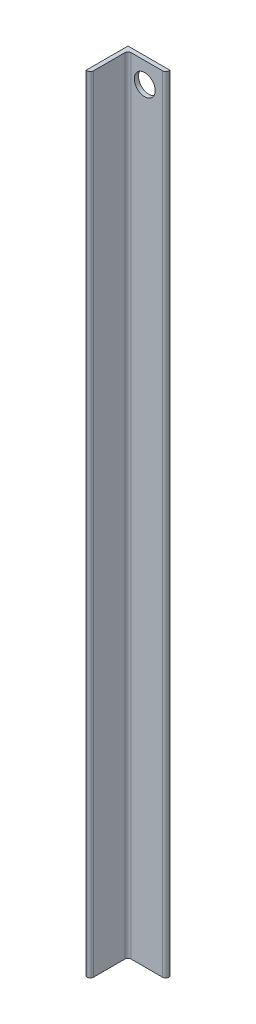
ISO-10303-21;
HEADER;
FILE_DESCRIPTION(('STEP AP214'),'2;1');
FILE_NAME('part.step','',(''),(''),'','','');
FILE_SCHEMA(('AUTOMOTIVE_DESIGN { 1 0 10303 214 1 1 1 1 }'));
ENDSEC;
DATA;
#1=APPLICATION_CONTEXT('core data for automotive mechanical design processes');
#2=APPLICATION_PROTOCOL_DEFINITION('international standard','automotive_design',2000,#1);
#3=PRODUCT_CONTEXT('',#1,'mechanical');
#4=PRODUCT('Part','Part','',(#3));
#5=PRODUCT_RELATED_PRODUCT_CATEGORY('part','',(#4));
#6=PRODUCT_DEFINITION_FORMATION('','',#4);
#7=PRODUCT_DEFINITION_CONTEXT('part definition',#1,'design');
#8=PRODUCT_DEFINITION('design','',#6,#7);
#9=PRODUCT_DEFINITION_SHAPE('','',#8);
#10=(LENGTH_UNIT() NAMED_UNIT(*) SI_UNIT(.MILLI.,.METRE.));
#11=(NAMED_UNIT(*) PLANE_ANGLE_UNIT() SI_UNIT($,.RADIAN.));
#12=(NAMED_UNIT(*) SI_UNIT($,.STERADIAN.) SOLID_ANGLE_UNIT());
#13=UNCERTAINTY_MEASURE_WITH_UNIT(LENGTH_MEASURE(1.E-05),#10,'distance_accuracy_value','');
#14=(GEOMETRIC_REPRESENTATION_CONTEXT(3) GLOBAL_UNCERTAINTY_ASSIGNED_CONTEXT((#13)) GLOBAL_UNIT_ASSIGNED_CONTEXT((#10,
#11,#12)) REPRESENTATION_CONTEXT('',''));
#15=CARTESIAN_POINT('',(0.,0.,0.));
#16=DIRECTION('',(0.,0.,1.));
#17=DIRECTION('',(1.,0.,0.));
#18=AXIS2_PLACEMENT_3D('',#15,#16,#17);
#19=CARTESIAN_POINT('',(-27.4998721449561,750.,-28.2131532770167));
#20=DIRECTION('',(-1.,0.,0.));
#21=DIRECTION('',(0.,0.,1.));
#22=AXIS2_PLACEMENT_3D('',#19,#20,#21);
#23=PLANE('',#22);
#24=DIRECTION('',(0.,0.,-1.));
#25=VECTOR('',#24,1.);
#26=CARTESIAN_POINT('',(-27.4998721449561,0.,-28.2131532770167));
#27=LINE('',#26,#25);
#28=CARTESIAN_POINT('',(-27.4998721449561,0.,-28.2131532770167));
#29=VERTEX_POINT('',#28);
#30=CARTESIAN_POINT('',(-27.4998721449561,0.,-29.2131532770167));
#31=VERTEX_POINT('',#30);
#32=EDGE_CURVE('E153',#29,#31,#27,.T.);
#33=ORIENTED_EDGE('',*,*,#32,.T.);
#34=DIRECTION('',(0.,-1.,0.));
#35=VECTOR('',#34,1.);
#36=CARTESIAN_POINT('',(-27.4998721449561,750.,-29.2131532770167));
#37=LINE('',#36,#35);
#38=CARTESIAN_POINT('',(-27.4998721449561,750.,-29.2131532770167));
#39=VERTEX_POINT('',#38);
#40=EDGE_CURVE('E13',#39,#31,#37,.T.);
#41=ORIENTED_EDGE('',*,*,#40,.F.);
#42=DIRECTION('',(0.,0.,-1.));
#43=VECTOR('',#42,1.);
#44=CARTESIAN_POINT('',(-27.4998721449561,750.,-28.2131532770167));
#45=LINE('',#44,#43);
#46=CARTESIAN_POINT('',(-27.4998721449561,750.,-28.2131532770167));
#47=VERTEX_POINT('',#46);
#48=EDGE_CURVE('E170',#47,#39,#45,.T.);
#49=ORIENTED_EDGE('',*,*,#48,.F.);
#50=DIRECTION('',(0.,-1.,0.));
#51=VECTOR('',#50,1.);
#52=CARTESIAN_POINT('',(-27.4998721449561,750.,-28.2131532770167));
#53=LINE('',#52,#51);
#54=EDGE_CURVE('E149',#47,#29,#53,.T.);
#55=ORIENTED_EDGE('',*,*,#54,.T.);
#56=EDGE_LOOP('',(#33,#41,#49,#55));
#57=FACE_BOUND('',#56,.T.);
#58=ADVANCED_FACE('F51',(#57),#23,.F.);
#59=CARTESIAN_POINT('',(-27.4998721449561,750.,-29.2131532770167));
#60=DIRECTION('',(0.,0.,1.));
#61=DIRECTION('',(1.,0.,0.));
#62=AXIS2_PLACEMENT_3D('',#59,#60,#61);
#63=PLANE('',#62);
#64=CARTESIAN_POINT('',(-47.4998721449523,730.,-29.2131532770167));
#65=DIRECTION('',(0.,0.,1.));
#66=DIRECTION('',(1.,0.,0.));
#67=AXIS2_PLACEMENT_3D('',#64,#65,#66);
#68=CIRCLE('',#67,10.);
#69=CARTESIAN_POINT('',(-37.4998721449523,730.,-29.2131532770167));
#70=VERTEX_POINT('',#69);
#71=EDGE_CURVE('E157',#70,#70,#68,.T.);
#72=ORIENTED_EDGE('',*,*,#71,.T.);
#73=EDGE_LOOP('',(#72));
#74=FACE_BOUND('',#73,.T.);
#75=DIRECTION('',(-1.,0.,0.));
#76=VECTOR('',#75,1.);
#77=CARTESIAN_POINT('',(-27.4998721449561,0.,-29.2131532770167));
#78=LINE('',#77,#76);
#79=CARTESIAN_POINT('',(-67.4998721449561,0.,-29.2131532770167));
#80=VERTEX_POINT('',#79);
#81=EDGE_CURVE('E156',#31,#80,#78,.T.);
#82=ORIENTED_EDGE('',*,*,#81,.T.);
#83=DIRECTION('',(0.,-1.,0.));
#84=VECTOR('',#83,1.);
#85=CARTESIAN_POINT('',(-67.4998721449561,750.,-29.2131532770167));
#86=LINE('',#85,#84);
#87=CARTESIAN_POINT('',(-67.4998721449561,750.,-29.2131532770167));
#88=VERTEX_POINT('',#87);
#89=EDGE_CURVE('E59',#88,#80,#86,.T.);
#90=ORIENTED_EDGE('',*,*,#89,.F.);
#91=DIRECTION('',(-1.,0.,0.));
#92=VECTOR('',#91,1.);
#93=CARTESIAN_POINT('',(-27.4998721449561,750.,-29.2131532770167));
#94=LINE('',#93,#92);
#95=EDGE_CURVE('E113',#39,#88,#94,.T.);
#96=ORIENTED_EDGE('',*,*,#95,.F.);
#97=ORIENTED_EDGE('',*,*,#40,.T.);
#98=EDGE_LOOP('',(#82,#90,#96,#97));
#99=FACE_BOUND('',#98,.T.);
#100=ADVANCED_FACE('F217',(#74,#99),#63,.F.);
#101=CARTESIAN_POINT('',(-67.4998721449561,750.,-29.2131532770167));
#102=DIRECTION('',(1.,0.,0.));
#103=DIRECTION('',(0.,0.,-1.));
#104=AXIS2_PLACEMENT_3D('',#101,#102,#103);
#105=PLANE('',#104);
#106=DIRECTION('',(0.,0.,1.));
#107=VECTOR('',#106,1.);
#108=CARTESIAN_POINT('',(-67.4998721449561,0.,-29.2131532770167));
#109=LINE('',#108,#107);
#110=CARTESIAN_POINT('',(-67.4998721449561,0.,10.7868467229834));
#111=VERTEX_POINT('',#110);
#112=EDGE_CURVE('E159',#80,#111,#109,.T.);
#113=ORIENTED_EDGE('',*,*,#112,.T.);
#114=DIRECTION('',(0.,-1.,0.));
#115=VECTOR('',#114,1.);
#116=CARTESIAN_POINT('',(-67.4998721449561,750.,10.7868467229834));
#117=LINE('',#116,#115);
#118=CARTESIAN_POINT('',(-67.4998721449561,750.,10.7868467229834));
#119=VERTEX_POINT('',#118);
#120=EDGE_CURVE('E180',#119,#111,#117,.T.);
#121=ORIENTED_EDGE('',*,*,#120,.F.);
#122=DIRECTION('',(0.,0.,1.));
#123=VECTOR('',#122,1.);
#124=CARTESIAN_POINT('',(-67.4998721449561,750.,-29.2131532770167));
#125=LINE('',#124,#123);
#126=EDGE_CURVE('E188',#88,#119,#125,.T.);
#127=ORIENTED_EDGE('',*,*,#126,.F.);
#128=ORIENTED_EDGE('',*,*,#89,.T.);
#129=EDGE_LOOP('',(#113,#121,#127,#128));
#130=FACE_BOUND('',#129,.T.);
#131=ADVANCED_FACE('F186',(#130),#105,.F.);
#132=CARTESIAN_POINT('',(-67.4998721449561,750.,10.7868467229834));
#133=DIRECTION('',(0.,0.,-1.));
#134=DIRECTION('',(-1.,0.,0.));
#135=AXIS2_PLACEMENT_3D('',#132,#133,#134);
#136=PLANE('',#135);
#137=DIRECTION('',(1.,0.,0.));
#138=VECTOR('',#137,1.);
#139=CARTESIAN_POINT('',(-67.4998721449561,0.,10.7868467229834));
#140=LINE('',#139,#138);
#141=CARTESIAN_POINT('',(-66.4998721449561,0.,10.7868467229834));
#142=VERTEX_POINT('',#141);
#143=EDGE_CURVE('E161',#111,#142,#140,.T.);
#144=ORIENTED_EDGE('',*,*,#143,.T.);
#145=DIRECTION('',(0.,-1.,0.));
#146=VECTOR('',#145,1.);
#147=CARTESIAN_POINT('',(-66.4998721449561,750.,10.7868467229834));
#148=LINE('',#147,#146);
#149=CARTESIAN_POINT('',(-66.4998721449561,750.,10.7868467229834));
#150=VERTEX_POINT('',#149);
#151=EDGE_CURVE('E177',#150,#142,#148,.T.);
#152=ORIENTED_EDGE('',*,*,#151,.F.);
#153=DIRECTION('',(1.,0.,0.));
#154=VECTOR('',#153,1.);
#155=CARTESIAN_POINT('',(-67.4998721449561,750.,10.7868467229834));
#156=LINE('',#155,#154);
#157=EDGE_CURVE('E204',#119,#150,#156,.T.);
#158=ORIENTED_EDGE('',*,*,#157,.F.);
#159=ORIENTED_EDGE('',*,*,#120,.T.);
#160=EDGE_LOOP('',(#144,#152,#158,#159));
#161=FACE_BOUND('',#160,.T.);
#162=ADVANCED_FACE('F197',(#161),#136,.F.);
#163=CARTESIAN_POINT('',(-66.4998721449561,750.,7.78684672298335));
#164=DIRECTION('',(0.,-1.,0.));
#165=DIRECTION('',(0.,0.,-1.));
#166=AXIS2_PLACEMENT_3D('',#163,#164,#165);
#167=CYLINDRICAL_SURFACE('',#166,3.);
#168=CARTESIAN_POINT('',(-66.4998721449561,0.,7.78684672298335));
#169=DIRECTION('',(0.,1.,0.));
#170=DIRECTION('',(0.,0.,1.));
#171=AXIS2_PLACEMENT_3D('',#168,#169,#170);
#172=CIRCLE('',#171,3.);
#173=CARTESIAN_POINT('',(-63.4998721449561,0.,7.78684672298335));
#174=VERTEX_POINT('',#173);
#175=EDGE_CURVE('E163',#142,#174,#172,.T.);
#176=ORIENTED_EDGE('',*,*,#175,.T.);
#177=DIRECTION('',(0.,-1.,0.));
#178=VECTOR('',#177,1.);
#179=CARTESIAN_POINT('',(-63.4998721449561,750.,7.78684672298335));
#180=LINE('',#179,#178);
#181=CARTESIAN_POINT('',(-63.4998721449561,750.,7.78684672298335));
#182=VERTEX_POINT('',#181);
#183=EDGE_CURVE('E174',#182,#174,#180,.T.);
#184=ORIENTED_EDGE('',*,*,#183,.F.);
#185=CARTESIAN_POINT('',(-66.4998721449561,750.,7.78684672298335));
#186=DIRECTION('',(0.,1.,0.));
#187=DIRECTION('',(0.,0.,1.));
#188=AXIS2_PLACEMENT_3D('',#185,#186,#187);
#189=CIRCLE('',#188,3.);
#190=EDGE_CURVE('E203',#150,#182,#189,.T.);
#191=ORIENTED_EDGE('',*,*,#190,.F.);
#192=ORIENTED_EDGE('',*,*,#151,.T.);
#193=EDGE_LOOP('',(#176,#184,#191,#192));
#194=FACE_BOUND('',#193,.T.);
#195=ADVANCED_FACE('F201',(#194),#167,.T.);
#196=CARTESIAN_POINT('',(-63.4998721449561,750.,7.78684672298335));
#197=DIRECTION('',(-1.,0.,0.));
#198=DIRECTION('',(0.,0.,1.));
#199=AXIS2_PLACEMENT_3D('',#196,#197,#198);
#200=PLANE('',#199);
#201=DIRECTION('',(0.,0.,-1.));
#202=VECTOR('',#201,1.);
#203=CARTESIAN_POINT('',(-63.4998721449561,0.,7.78684672298335));
#204=LINE('',#203,#202);
#205=CARTESIAN_POINT('',(-63.4998721449561,0.,-22.2131532770167));
#206=VERTEX_POINT('',#205);
#207=EDGE_CURVE('E165',#174,#206,#204,.T.);
#208=ORIENTED_EDGE('',*,*,#207,.T.);
#209=DIRECTION('',(0.,-1.,0.));
#210=VECTOR('',#209,1.);
#211=CARTESIAN_POINT('',(-63.4998721449561,750.,-22.2131532770167));
#212=LINE('',#211,#210);
#213=CARTESIAN_POINT('',(-63.4998721449561,750.,-22.2131532770167));
#214=VERTEX_POINT('',#213);
#215=EDGE_CURVE('E144',#214,#206,#212,.T.);
#216=ORIENTED_EDGE('',*,*,#215,.F.);
#217=DIRECTION('',(0.,0.,-1.));
#218=VECTOR('',#217,1.);
#219=CARTESIAN_POINT('',(-63.4998721449561,750.,7.78684672298335));
#220=LINE('',#219,#218);
#221=EDGE_CURVE('E135',#182,#214,#220,.T.);
#222=ORIENTED_EDGE('',*,*,#221,.F.);
#223=ORIENTED_EDGE('',*,*,#183,.T.);
#224=EDGE_LOOP('',(#208,#216,#222,#223));
#225=FACE_BOUND('',#224,.T.);
#226=ADVANCED_FACE('F233',(#225),#200,.F.);
#227=CARTESIAN_POINT('',(-60.4998721449562,750.,-22.2131532770167));
#228=DIRECTION('',(0.,-1.,0.));
#229=DIRECTION('',(0.,0.,-1.));
#230=AXIS2_PLACEMENT_3D('',#227,#228,#229);
#231=CYLINDRICAL_SURFACE('',#230,3.);
#232=CARTESIAN_POINT('',(-60.4998721449561,0.,-22.2131532770167));
#233=DIRECTION('',(0.,-1.,0.));
#234=DIRECTION('',(0.,0.,-1.));
#235=AXIS2_PLACEMENT_3D('',#232,#233,#234);
#236=CIRCLE('',#235,3.);
#237=CARTESIAN_POINT('',(-60.4998721449561,0.,-25.2131532770167));
#238=VERTEX_POINT('',#237);
#239=EDGE_CURVE('E143',#206,#238,#236,.T.);
#240=ORIENTED_EDGE('',*,*,#239,.T.);
#241=DIRECTION('',(0.,-1.,0.));
#242=VECTOR('',#241,1.);
#243=CARTESIAN_POINT('',(-60.4998721449562,750.,-25.2131532770167));
#244=LINE('',#243,#242);
#245=CARTESIAN_POINT('',(-60.4998721449562,750.,-25.2131532770167));
#246=VERTEX_POINT('',#245);
#247=EDGE_CURVE('E140',#246,#238,#244,.T.);
#248=ORIENTED_EDGE('',*,*,#247,.F.);
#249=CARTESIAN_POINT('',(-60.4998721449562,750.,-22.2131532770167));
#250=DIRECTION('',(0.,-1.,0.));
#251=DIRECTION('',(0.,0.,-1.));
#252=AXIS2_PLACEMENT_3D('',#249,#250,#251);
#253=CIRCLE('',#252,3.);
#254=EDGE_CURVE('E129',#214,#246,#253,.T.);
#255=ORIENTED_EDGE('',*,*,#254,.F.);
#256=ORIENTED_EDGE('',*,*,#215,.T.);
#257=EDGE_LOOP('',(#240,#248,#255,#256));
#258=FACE_BOUND('',#257,.T.);
#259=ADVANCED_FACE('F141',(#258),#231,.F.);
#260=CARTESIAN_POINT('',(-60.4998721449561,750.,-25.2131532770167));
#261=DIRECTION('',(0.,0.,-1.));
#262=DIRECTION('',(-1.,0.,0.));
#263=AXIS2_PLACEMENT_3D('',#260,#261,#262);
#264=PLANE('',#263);
#265=CARTESIAN_POINT('',(-47.4998721449523,730.,-25.2131532770167));
#266=DIRECTION('',(0.,0.,1.));
#267=DIRECTION('',(1.,0.,0.));
#268=AXIS2_PLACEMENT_3D('',#265,#266,#267);
#269=CIRCLE('',#268,10.);
#270=CARTESIAN_POINT('',(-37.4998721449523,730.,-25.2131532770167));
#271=VERTEX_POINT('',#270);
#272=EDGE_CURVE('E211',#271,#271,#269,.T.);
#273=ORIENTED_EDGE('',*,*,#272,.F.);
#274=EDGE_LOOP('',(#273));
#275=FACE_BOUND('',#274,.T.);
#276=DIRECTION('',(1.,0.,0.));
#277=VECTOR('',#276,1.);
#278=CARTESIAN_POINT('',(-60.4998721449561,0.,-25.2131532770167));
#279=LINE('',#278,#277);
#280=CARTESIAN_POINT('',(-30.4998721449561,0.,-25.2131532770167));
#281=VERTEX_POINT('',#280);
#282=EDGE_CURVE('E99',#238,#281,#279,.T.);
#283=ORIENTED_EDGE('',*,*,#282,.T.);
#284=DIRECTION('',(0.,-1.,0.));
#285=VECTOR('',#284,1.);
#286=CARTESIAN_POINT('',(-30.4998721449561,750.,-25.2131532770167));
#287=LINE('',#286,#285);
#288=CARTESIAN_POINT('',(-30.4998721449561,750.,-25.2131532770167));
#289=VERTEX_POINT('',#288);
#290=EDGE_CURVE('E145',#289,#281,#287,.T.);
#291=ORIENTED_EDGE('',*,*,#290,.F.);
#292=DIRECTION('',(1.,0.,0.));
#293=VECTOR('',#292,1.);
#294=CARTESIAN_POINT('',(-60.4998721449561,750.,-25.2131532770167));
#295=LINE('',#294,#293);
#296=EDGE_CURVE('E133',#246,#289,#295,.T.);
#297=ORIENTED_EDGE('',*,*,#296,.F.);
#298=ORIENTED_EDGE('',*,*,#247,.T.);
#299=EDGE_LOOP('',(#283,#291,#297,#298));
#300=FACE_BOUND('',#299,.T.);
#301=ADVANCED_FACE('F147',(#275,#300),#264,.F.);
#302=CARTESIAN_POINT('',(-30.4998721449561,750.,-28.2131532770167));
#303=DIRECTION('',(0.,-1.,0.));
#304=DIRECTION('',(0.,0.,-1.));
#305=AXIS2_PLACEMENT_3D('',#302,#303,#304);
#306=CYLINDRICAL_SURFACE('',#305,3.);
#307=CARTESIAN_POINT('',(-30.4998721449561,0.,-28.2131532770167));
#308=DIRECTION('',(0.,1.,0.));
#309=DIRECTION('',(0.,0.,1.));
#310=AXIS2_PLACEMENT_3D('',#307,#308,#309);
#311=CIRCLE('',#310,3.);
#312=EDGE_CURVE('E105',#281,#29,#311,.T.);
#313=ORIENTED_EDGE('',*,*,#312,.T.);
#314=ORIENTED_EDGE('',*,*,#54,.F.);
#315=CARTESIAN_POINT('',(-30.4998721449561,750.,-28.2131532770167));
#316=DIRECTION('',(0.,1.,0.));
#317=DIRECTION('',(0.,0.,1.));
#318=AXIS2_PLACEMENT_3D('',#315,#316,#317);
#319=CIRCLE('',#318,3.);
#320=EDGE_CURVE('E67',#289,#47,#319,.T.);
#321=ORIENTED_EDGE('',*,*,#320,.F.);
#322=ORIENTED_EDGE('',*,*,#290,.T.);
#323=EDGE_LOOP('',(#313,#314,#321,#322));
#324=FACE_BOUND('',#323,.T.);
#325=ADVANCED_FACE('F226',(#324),#306,.T.);
#326=CARTESIAN_POINT('',(-66.4998721449561,750.,7.78684672298335));
#327=DIRECTION('',(0.,1.,0.));
#328=DIRECTION('',(0.,0.,1.));
#329=AXIS2_PLACEMENT_3D('',#326,#327,#328);
#330=PLANE('',#329);
#331=ORIENTED_EDGE('',*,*,#48,.T.);
#332=ORIENTED_EDGE('',*,*,#95,.T.);
#333=ORIENTED_EDGE('',*,*,#126,.T.);
#334=ORIENTED_EDGE('',*,*,#157,.T.);
#335=ORIENTED_EDGE('',*,*,#190,.T.);
#336=ORIENTED_EDGE('',*,*,#221,.T.);
#337=ORIENTED_EDGE('',*,*,#254,.T.);
#338=ORIENTED_EDGE('',*,*,#296,.T.);
#339=ORIENTED_EDGE('',*,*,#320,.T.);
#340=EDGE_LOOP('',(#331,#332,#333,#334,#335,#336,#337,#338,#339));
#341=FACE_BOUND('',#340,.T.);
#342=ADVANCED_FACE('F131',(#341),#330,.T.);
#343=CARTESIAN_POINT('',(-66.4998721449561,0.,7.78684672298335));
#344=DIRECTION('',(0.,1.,0.));
#345=DIRECTION('',(0.,0.,1.));
#346=AXIS2_PLACEMENT_3D('',#343,#344,#345);
#347=PLANE('',#346);
#348=ORIENTED_EDGE('',*,*,#32,.F.);
#349=ORIENTED_EDGE('',*,*,#312,.F.);
#350=ORIENTED_EDGE('',*,*,#282,.F.);
#351=ORIENTED_EDGE('',*,*,#239,.F.);
#352=ORIENTED_EDGE('',*,*,#207,.F.);
#353=ORIENTED_EDGE('',*,*,#175,.F.);
#354=ORIENTED_EDGE('',*,*,#143,.F.);
#355=ORIENTED_EDGE('',*,*,#112,.F.);
#356=ORIENTED_EDGE('',*,*,#81,.F.);
#357=EDGE_LOOP('',(#348,#349,#350,#351,#352,#353,#354,#355,#356));
#358=FACE_BOUND('',#357,.T.);
#359=ADVANCED_FACE('F192',(#358),#347,.F.);
#360=CARTESIAN_POINT('',(-47.4998721449523,730.,-29.2131532770167));
#361=DIRECTION('',(0.,0.,1.));
#362=DIRECTION('',(1.,0.,0.));
#363=AXIS2_PLACEMENT_3D('',#360,#361,#362);
#364=CYLINDRICAL_SURFACE('',#363,10.);
#365=ORIENTED_EDGE('',*,*,#71,.F.);
#366=EDGE_LOOP('',(#365));
#367=FACE_BOUND('',#366,.T.);
#368=ORIENTED_EDGE('',*,*,#272,.T.);
#369=EDGE_LOOP('',(#368));
#370=FACE_BOUND('',#369,.T.);
#371=ADVANCED_FACE('F219',(#367,#370),#364,.F.);
#372=CLOSED_SHELL('',(#58,#100,#131,#162,#195,#226,#259,#301,#325,#342,#359,#371));
#373=MANIFOLD_SOLID_BREP('B2',#372);
#374=ADVANCED_BREP_SHAPE_REPRESENTATION('',(#18,#373),#14);
#375=SHAPE_DEFINITION_REPRESENTATION(#9,#374);
ENDSEC;
END-ISO-10303-21;
